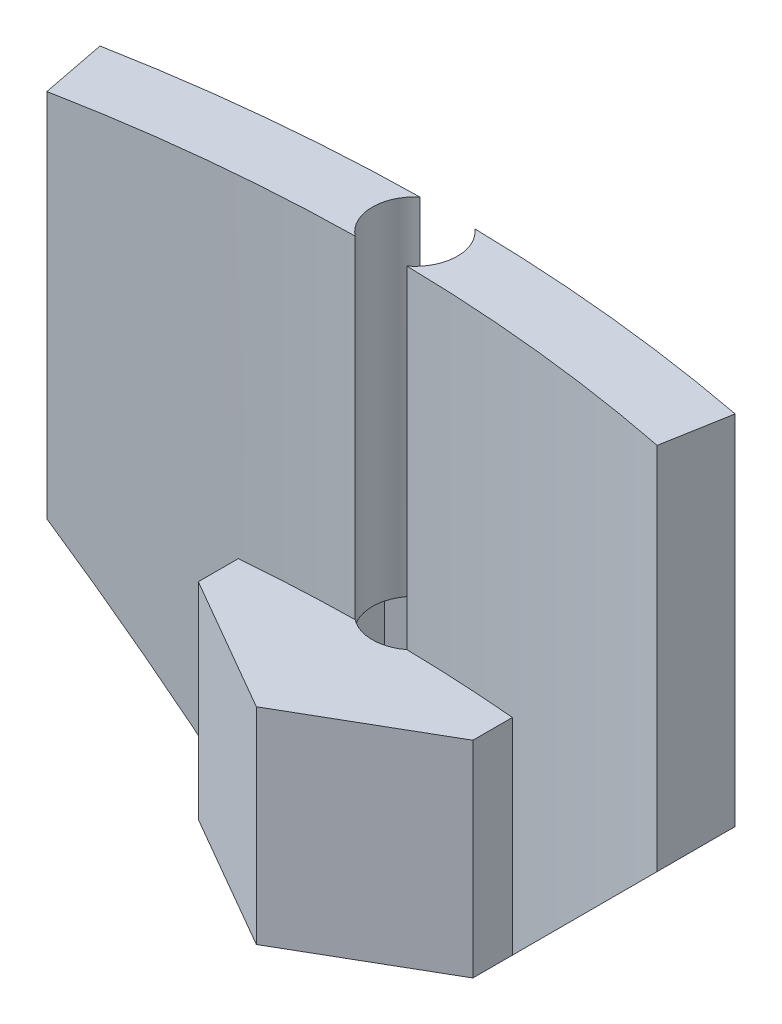
ISO-10303-21;
HEADER;
FILE_DESCRIPTION(('STEP AP214'),'2;1');
FILE_NAME('part.step','',(''),(''),'','','');
FILE_SCHEMA(('AUTOMOTIVE_DESIGN { 1 0 10303 214 1 1 1 1 }'));
ENDSEC;
DATA;
#1=APPLICATION_CONTEXT('core data for automotive mechanical design processes');
#2=APPLICATION_PROTOCOL_DEFINITION('international standard','automotive_design',2000,#1);
#3=PRODUCT_CONTEXT('',#1,'mechanical');
#4=PRODUCT('Part','Part','',(#3));
#5=PRODUCT_RELATED_PRODUCT_CATEGORY('part','',(#4));
#6=PRODUCT_DEFINITION_FORMATION('','',#4);
#7=PRODUCT_DEFINITION_CONTEXT('part definition',#1,'design');
#8=PRODUCT_DEFINITION('design','',#6,#7);
#9=PRODUCT_DEFINITION_SHAPE('','',#8);
#10=(LENGTH_UNIT() NAMED_UNIT(*) SI_UNIT(.MILLI.,.METRE.));
#11=(NAMED_UNIT(*) PLANE_ANGLE_UNIT() SI_UNIT($,.RADIAN.));
#12=(NAMED_UNIT(*) SI_UNIT($,.STERADIAN.) SOLID_ANGLE_UNIT());
#13=UNCERTAINTY_MEASURE_WITH_UNIT(LENGTH_MEASURE(1.E-05),#10,'distance_accuracy_value','');
#14=(GEOMETRIC_REPRESENTATION_CONTEXT(3) GLOBAL_UNCERTAINTY_ASSIGNED_CONTEXT((#13)) GLOBAL_UNIT_ASSIGNED_CONTEXT((#10,
#11,#12)) REPRESENTATION_CONTEXT('',''));
#15=CARTESIAN_POINT('',(0.,0.,0.));
#16=DIRECTION('',(0.,0.,1.));
#17=DIRECTION('',(1.,0.,0.));
#18=AXIS2_PLACEMENT_3D('',#15,#16,#17);
#19=CARTESIAN_POINT('',(10.,-15.,4.42781527170371));
#20=DIRECTION('',(1.,0.,0.));
#21=DIRECTION('',(0.,0.,-1.));
#22=AXIS2_PLACEMENT_3D('',#19,#20,#21);
#23=PLANE('',#22);
#24=DIRECTION('',(0.,0.,-1.));
#25=VECTOR('',#24,1.);
#26=CARTESIAN_POINT('',(10.,0.,4.42781527170371));
#27=LINE('',#26,#25);
#28=CARTESIAN_POINT('',(10.,0.,-3.30745786510135));
#29=VERTEX_POINT('',#28);
#30=CARTESIAN_POINT('',(10.,0.,-7.11919011208881));
#31=VERTEX_POINT('',#30);
#32=EDGE_CURVE('E450',#29,#31,#27,.T.);
#33=ORIENTED_EDGE('',*,*,#32,.F.);
#34=DIRECTION('',(0.,-1.,0.));
#35=VECTOR('',#34,1.);
#36=CARTESIAN_POINT('',(10.,0.,-3.30745786510135));
#37=LINE('',#36,#35);
#38=CARTESIAN_POINT('',(10.,-15.,-3.30745786510134));
#39=VERTEX_POINT('',#38);
#40=EDGE_CURVE('E214',#29,#39,#37,.T.);
#41=ORIENTED_EDGE('',*,*,#40,.T.);
#42=DIRECTION('',(0.,0.,-1.));
#43=VECTOR('',#42,1.);
#44=CARTESIAN_POINT('',(10.,-15.,4.42781527170371));
#45=LINE('',#44,#43);
#46=CARTESIAN_POINT('',(10.,-15.,-7.11919011208881));
#47=VERTEX_POINT('',#46);
#48=EDGE_CURVE('E469',#39,#47,#45,.T.);
#49=ORIENTED_EDGE('',*,*,#48,.T.);
#50=DIRECTION('',(0.,1.,0.));
#51=VECTOR('',#50,1.);
#52=CARTESIAN_POINT('',(10.,-15.,-7.11919011208881));
#53=LINE('',#52,#51);
#54=EDGE_CURVE('E486',#47,#31,#53,.T.);
#55=ORIENTED_EDGE('',*,*,#54,.T.);
#56=EDGE_LOOP('',(#33,#41,#49,#55));
#57=FACE_BOUND('',#56,.T.);
#58=ADVANCED_FACE('F190',(#57),#23,.T.);
#59=CARTESIAN_POINT('',(-10.,-15.,-7.11919011208881));
#60=DIRECTION('',(-1.,0.,0.));
#61=DIRECTION('',(0.,0.,1.));
#62=AXIS2_PLACEMENT_3D('',#59,#60,#61);
#63=PLANE('',#62);
#64=DIRECTION('',(0.,0.,1.));
#65=VECTOR('',#64,1.);
#66=CARTESIAN_POINT('',(-10.,0.,-7.11919011208881));
#67=LINE('',#66,#65);
#68=CARTESIAN_POINT('',(-10.,0.,1.51510033963902));
#69=VERTEX_POINT('',#68);
#70=CARTESIAN_POINT('',(-10.,0.,4.42781527170371));
#71=VERTEX_POINT('',#70);
#72=EDGE_CURVE('E496',#69,#71,#67,.T.);
#73=ORIENTED_EDGE('',*,*,#72,.F.);
#74=DIRECTION('',(0.,-1.,0.));
#75=VECTOR('',#74,1.);
#76=CARTESIAN_POINT('',(-10.,0.,1.51510033963902));
#77=LINE('',#76,#75);
#78=CARTESIAN_POINT('',(-10.,-15.,1.51510033963902));
#79=VERTEX_POINT('',#78);
#80=EDGE_CURVE('E234',#69,#79,#77,.T.);
#81=ORIENTED_EDGE('',*,*,#80,.T.);
#82=DIRECTION('',(0.,0.,1.));
#83=VECTOR('',#82,1.);
#84=CARTESIAN_POINT('',(-10.,-15.,-7.11919011208881));
#85=LINE('',#84,#83);
#86=CARTESIAN_POINT('',(-10.,-15.,4.42781527170371));
#87=VERTEX_POINT('',#86);
#88=EDGE_CURVE('E475',#79,#87,#85,.T.);
#89=ORIENTED_EDGE('',*,*,#88,.T.);
#90=DIRECTION('',(0.,1.,0.));
#91=VECTOR('',#90,1.);
#92=CARTESIAN_POINT('',(-10.,-15.,4.42781527170371));
#93=LINE('',#92,#91);
#94=EDGE_CURVE('E511',#87,#71,#93,.T.);
#95=ORIENTED_EDGE('',*,*,#94,.T.);
#96=EDGE_LOOP('',(#73,#81,#89,#95));
#97=FACE_BOUND('',#96,.T.);
#98=ADVANCED_FACE('F580',(#97),#63,.T.);
#99=CARTESIAN_POINT('',(-0.203357416899216,7.,116.598877624272));
#100=DIRECTION('',(0.,-1.,0.));
#101=DIRECTION('',(0.,0.,-1.));
#102=AXIS2_PLACEMENT_3D('',#99,#100,#101);
#103=CYLINDRICAL_SURFACE('',#102,115.5);
#104=CARTESIAN_POINT('',(-0.203357416899216,0.,116.598877624272));
#105=DIRECTION('',(0.,1.,0.));
#106=DIRECTION('',(0.,0.,1.));
#107=AXIS2_PLACEMENT_3D('',#104,#105,#106);
#108=CIRCLE('',#107,115.5);
#109=CARTESIAN_POINT('',(10.,0.,1.55044652926299));
#110=VERTEX_POINT('',#109);
#111=CARTESIAN_POINT('',(1.88194158466165,0.,1.1177037123563));
#112=VERTEX_POINT('',#111);
#113=EDGE_CURVE('E520',#110,#112,#108,.T.);
#114=ORIENTED_EDGE('',*,*,#113,.F.);
#115=DIRECTION('',(0.,-1.,0.));
#116=VECTOR('',#115,1.);
#117=CARTESIAN_POINT('',(10.,-15.,1.55044652926298));
#118=LINE('',#117,#116);
#119=CARTESIAN_POINT('',(10.,-15.,1.55044652926298));
#120=VERTEX_POINT('',#119);
#121=EDGE_CURVE('E533',#120,#110,#118,.F.);
#122=ORIENTED_EDGE('',*,*,#121,.F.);
#123=CARTESIAN_POINT('',(-0.203357416899216,-25.203357416899,116.598877624272));
#124=DIRECTION('',(-0.707106781186541,0.707106781186554,0.));
#125=DIRECTION('',(-0.707106781186554,-0.707106781186541,0.));
#126=AXIS2_PLACEMENT_3D('',#123,#124,#125);
#127=ELLIPSE('',#126,163.341666454091,115.5);
#128=CARTESIAN_POINT('',(22.3120871398352,-2.68791286016501,3.31470063378207));
#129=VERTEX_POINT('',#128);
#130=EDGE_CURVE('E12',#120,#129,#127,.F.);
#131=ORIENTED_EDGE('',*,*,#130,.T.);
#132=DIRECTION('',(0.,-1.,0.));
#133=VECTOR('',#132,1.);
#134=CARTESIAN_POINT('',(22.3120871398352,24.2,3.31470063378207));
#135=LINE('',#134,#133);
#136=CARTESIAN_POINT('',(22.3120871398352,24.2,3.31470063378207));
#137=VERTEX_POINT('',#136);
#138=EDGE_CURVE('E206',#137,#129,#135,.T.);
#139=ORIENTED_EDGE('',*,*,#138,.F.);
#140=CARTESIAN_POINT('',(-0.203357416899216,24.2,116.598877624272));
#141=DIRECTION('',(0.,1.,0.));
#142=DIRECTION('',(0.,0.,1.));
#143=AXIS2_PLACEMENT_3D('',#140,#141,#142);
#144=CIRCLE('',#143,115.5);
#145=CARTESIAN_POINT('',(1.88194158466172,24.2,1.11770371235628));
#146=VERTEX_POINT('',#145);
#147=EDGE_CURVE('E383',#146,#137,#144,.F.);
#148=ORIENTED_EDGE('',*,*,#147,.F.);
#149=DIRECTION('',(0.,-1.,0.));
#150=VECTOR('',#149,1.);
#151=CARTESIAN_POINT('',(1.88194158466174,-4.,1.11770371235641));
#152=LINE('',#151,#150);
#153=EDGE_CURVE('E411',#112,#146,#152,.F.);
#154=ORIENTED_EDGE('',*,*,#153,.F.);
#155=EDGE_LOOP('',(#114,#122,#131,#139,#148,#154));
#156=FACE_BOUND('',#155,.T.);
#157=ADVANCED_FACE('F557',(#156),#103,.F.);
#158=CARTESIAN_POINT('',(-0.203357416899206,7.,120.773731270976));
#159=DIRECTION('',(0.,-1.,0.));
#160=DIRECTION('',(0.,0.,-1.));
#161=AXIS2_PLACEMENT_3D('',#158,#159,#160);
#162=CYLINDRICAL_SURFACE('',#161,124.5);
#163=DIRECTION('',(0.,-1.,0.));
#164=VECTOR('',#163,1.);
#165=CARTESIAN_POINT('',(23.1634824320167,24.2,-1.5138020080754));
#166=LINE('',#165,#164);
#167=CARTESIAN_POINT('',(23.1634824320167,24.2,-1.5138020080754));
#168=VERTEX_POINT('',#167);
#169=CARTESIAN_POINT('',(23.1634824320167,-1.83651756798348,-1.5138020080754));
#170=VERTEX_POINT('',#169);
#171=EDGE_CURVE('E362',#168,#170,#166,.T.);
#172=ORIENTED_EDGE('',*,*,#171,.T.);
#173=CARTESIAN_POINT('',(-0.203357416899206,-25.203357416899,120.773731270976));
#174=DIRECTION('',(-0.707106781186541,0.707106781186554,0.));
#175=DIRECTION('',(-0.707106781186554,-0.707106781186541,0.));
#176=AXIS2_PLACEMENT_3D('',#173,#174,#175);
#177=ELLIPSE('',#176,176.069588515449,124.5);
#178=EDGE_CURVE('E199',#170,#39,#177,.T.);
#179=ORIENTED_EDGE('',*,*,#178,.T.);
#180=ORIENTED_EDGE('',*,*,#40,.F.);
#181=CARTESIAN_POINT('',(-0.203357416899206,0.,120.773731270976));
#182=DIRECTION('',(0.,1.,0.));
#183=DIRECTION('',(0.,0.,1.));
#184=AXIS2_PLACEMENT_3D('',#181,#182,#183);
#185=CIRCLE('',#184,124.5);
#186=CARTESIAN_POINT('',(2.00899020180866,0.,-3.70661062289088));
#187=VERTEX_POINT('',#186);
#188=EDGE_CURVE('E521',#187,#29,#185,.F.);
#189=ORIENTED_EDGE('',*,*,#188,.F.);
#190=DIRECTION('',(0.,-1.,0.));
#191=VECTOR('',#190,1.);
#192=CARTESIAN_POINT('',(2.0089902018084,-4.,-3.70661062289057));
#193=LINE('',#192,#191);
#194=CARTESIAN_POINT('',(2.0089902018084,24.2,-3.70661062289086));
#195=VERTEX_POINT('',#194);
#196=EDGE_CURVE('E375',#195,#187,#193,.T.);
#197=ORIENTED_EDGE('',*,*,#196,.F.);
#198=CARTESIAN_POINT('',(-0.203357416899206,24.2,120.773731270976));
#199=DIRECTION('',(0.,1.,0.));
#200=DIRECTION('',(0.,0.,1.));
#201=AXIS2_PLACEMENT_3D('',#198,#199,#200);
#202=CIRCLE('',#201,124.5);
#203=EDGE_CURVE('E373',#168,#195,#202,.T.);
#204=ORIENTED_EDGE('',*,*,#203,.F.);
#205=EDGE_LOOP('',(#172,#179,#180,#189,#197,#204));
#206=FACE_BOUND('',#205,.T.);
#207=ADVANCED_FACE('F374',(#206),#162,.T.);
#208=CARTESIAN_POINT('',(5.25,-15.,1.68540149305299));
#209=DIRECTION('',(1.,0.,0.));
#210=DIRECTION('',(0.,0.,-1.));
#211=AXIS2_PLACEMENT_3D('',#208,#209,#210);
#212=PLANE('',#211);
#213=DIRECTION('',(0.,0.,1.));
#214=VECTOR('',#213,1.);
#215=CARTESIAN_POINT('',(5.25,-1.,1.68540149305299));
#216=LINE('',#215,#214);
#217=CARTESIAN_POINT('',(5.25,-1.,-4.37677633343809));
#218=VERTEX_POINT('',#217);
#219=CARTESIAN_POINT('',(5.25,-1.,1.68540149305299));
#220=VERTEX_POINT('',#219);
#221=EDGE_CURVE('E425',#218,#220,#216,.T.);
#222=ORIENTED_EDGE('',*,*,#221,.F.);
#223=DIRECTION('',(0.,1.,0.));
#224=VECTOR('',#223,1.);
#225=CARTESIAN_POINT('',(5.25,-15.,-4.37677633343809));
#226=LINE('',#225,#224);
#227=CARTESIAN_POINT('',(5.25,-15.,-4.37677633343809));
#228=VERTEX_POINT('',#227);
#229=EDGE_CURVE('E446',#228,#218,#226,.T.);
#230=ORIENTED_EDGE('',*,*,#229,.F.);
#231=DIRECTION('',(0.,0.,-1.));
#232=VECTOR('',#231,1.);
#233=CARTESIAN_POINT('',(5.25,-15.,1.68540149305299));
#234=LINE('',#233,#232);
#235=CARTESIAN_POINT('',(5.25,-15.,1.68540149305299));
#236=VERTEX_POINT('',#235);
#237=EDGE_CURVE('E428',#236,#228,#234,.T.);
#238=ORIENTED_EDGE('',*,*,#237,.F.);
#239=DIRECTION('',(0.,1.,0.));
#240=VECTOR('',#239,1.);
#241=CARTESIAN_POINT('',(5.25,-15.,1.68540149305299));
#242=LINE('',#241,#240);
#243=EDGE_CURVE('E447',#236,#220,#242,.T.);
#244=ORIENTED_EDGE('',*,*,#243,.T.);
#245=EDGE_LOOP('',(#222,#230,#238,#244));
#246=FACE_BOUND('',#245,.T.);
#247=ADVANCED_FACE('F736',(#246),#212,.F.);
#248=CARTESIAN_POINT('',(0.,-15.,4.71649040629852));
#249=DIRECTION('',(0.5,0.,0.866025403784439));
#250=DIRECTION('',(0.866025403784439,0.,-0.5));
#251=AXIS2_PLACEMENT_3D('',#248,#249,#250);
#252=PLANE('',#251);
#253=DIRECTION('',(-0.866025403784439,0.,0.5));
#254=VECTOR('',#253,1.);
#255=CARTESIAN_POINT('',(0.,-1.,4.71649040629852));
#256=LINE('',#255,#254);
#257=CARTESIAN_POINT('',(0.,-1.,4.71649040629852));
#258=VERTEX_POINT('',#257);
#259=EDGE_CURVE('E422',#220,#258,#256,.T.);
#260=ORIENTED_EDGE('',*,*,#259,.F.);
#261=ORIENTED_EDGE('',*,*,#243,.F.);
#262=DIRECTION('',(0.866025403784439,0.,-0.5));
#263=VECTOR('',#262,1.);
#264=CARTESIAN_POINT('',(0.,-15.,4.71649040629852));
#265=LINE('',#264,#263);
#266=CARTESIAN_POINT('',(0.,-15.,4.71649040629852));
#267=VERTEX_POINT('',#266);
#268=EDGE_CURVE('E443',#267,#236,#265,.T.);
#269=ORIENTED_EDGE('',*,*,#268,.F.);
#270=DIRECTION('',(0.,1.,0.));
#271=VECTOR('',#270,1.);
#272=CARTESIAN_POINT('',(0.,-15.,4.71649040629852));
#273=LINE('',#272,#271);
#274=EDGE_CURVE('E451',#267,#258,#273,.T.);
#275=ORIENTED_EDGE('',*,*,#274,.T.);
#276=EDGE_LOOP('',(#260,#261,#269,#275));
#277=FACE_BOUND('',#276,.T.);
#278=ADVANCED_FACE('F820',(#277),#252,.F.);
#279=CARTESIAN_POINT('',(-5.25,-15.,1.68540149305298));
#280=DIRECTION('',(-0.5,0.,0.866025403784439));
#281=DIRECTION('',(0.866025403784439,0.,0.5));
#282=AXIS2_PLACEMENT_3D('',#279,#280,#281);
#283=PLANE('',#282);
#284=DIRECTION('',(-0.866025403784439,0.,-0.5));
#285=VECTOR('',#284,1.);
#286=CARTESIAN_POINT('',(-5.25,-1.,1.68540149305298));
#287=LINE('',#286,#285);
#288=CARTESIAN_POINT('',(-5.25,-1.,1.68540149305298));
#289=VERTEX_POINT('',#288);
#290=EDGE_CURVE('E419',#258,#289,#287,.T.);
#291=ORIENTED_EDGE('',*,*,#290,.F.);
#292=ORIENTED_EDGE('',*,*,#274,.F.);
#293=DIRECTION('',(0.866025403784439,0.,0.5));
#294=VECTOR('',#293,1.);
#295=CARTESIAN_POINT('',(-5.25,-15.,1.68540149305298));
#296=LINE('',#295,#294);
#297=CARTESIAN_POINT('',(-5.25,-15.,1.68540149305298));
#298=VERTEX_POINT('',#297);
#299=EDGE_CURVE('E440',#298,#267,#296,.T.);
#300=ORIENTED_EDGE('',*,*,#299,.F.);
#301=DIRECTION('',(0.,1.,0.));
#302=VECTOR('',#301,1.);
#303=CARTESIAN_POINT('',(-5.25,-15.,1.68540149305298));
#304=LINE('',#303,#302);
#305=EDGE_CURVE('E454',#298,#289,#304,.T.);
#306=ORIENTED_EDGE('',*,*,#305,.T.);
#307=EDGE_LOOP('',(#291,#292,#300,#306));
#308=FACE_BOUND('',#307,.T.);
#309=ADVANCED_FACE('F810',(#308),#283,.F.);
#310=CARTESIAN_POINT('',(-5.25,-15.,-4.37677633343809));
#311=DIRECTION('',(-1.,0.,0.));
#312=DIRECTION('',(0.,0.,1.));
#313=AXIS2_PLACEMENT_3D('',#310,#311,#312);
#314=PLANE('',#313);
#315=DIRECTION('',(0.,0.,-1.));
#316=VECTOR('',#315,1.);
#317=CARTESIAN_POINT('',(-5.25,-1.,-4.37677633343809));
#318=LINE('',#317,#316);
#319=CARTESIAN_POINT('',(-5.25,-1.,-4.37677633343809));
#320=VERTEX_POINT('',#319);
#321=EDGE_CURVE('E416',#289,#320,#318,.T.);
#322=ORIENTED_EDGE('',*,*,#321,.F.);
#323=ORIENTED_EDGE('',*,*,#305,.F.);
#324=DIRECTION('',(0.,0.,1.));
#325=VECTOR('',#324,1.);
#326=CARTESIAN_POINT('',(-5.25,-15.,-4.37677633343809));
#327=LINE('',#326,#325);
#328=CARTESIAN_POINT('',(-5.25,-15.,-4.37677633343809));
#329=VERTEX_POINT('',#328);
#330=EDGE_CURVE('E437',#329,#298,#327,.T.);
#331=ORIENTED_EDGE('',*,*,#330,.F.);
#332=DIRECTION('',(0.,1.,0.));
#333=VECTOR('',#332,1.);
#334=CARTESIAN_POINT('',(-5.25,-15.,-4.37677633343809));
#335=LINE('',#334,#333);
#336=EDGE_CURVE('E457',#329,#320,#335,.T.);
#337=ORIENTED_EDGE('',*,*,#336,.T.);
#338=EDGE_LOOP('',(#322,#323,#331,#337));
#339=FACE_BOUND('',#338,.T.);
#340=ADVANCED_FACE('F800',(#339),#314,.F.);
#341=CARTESIAN_POINT('',(0.,-15.,-7.40786524668362));
#342=DIRECTION('',(-0.5,0.,-0.866025403784439));
#343=DIRECTION('',(-0.866025403784439,0.,0.5));
#344=AXIS2_PLACEMENT_3D('',#341,#342,#343);
#345=PLANE('',#344);
#346=DIRECTION('',(0.866025403784439,0.,-0.5));
#347=VECTOR('',#346,1.);
#348=CARTESIAN_POINT('',(0.,-1.,-7.40786524668362));
#349=LINE('',#348,#347);
#350=CARTESIAN_POINT('',(0.,-1.,-7.40786524668362));
#351=VERTEX_POINT('',#350);
#352=EDGE_CURVE('E413',#320,#351,#349,.T.);
#353=ORIENTED_EDGE('',*,*,#352,.F.);
#354=ORIENTED_EDGE('',*,*,#336,.F.);
#355=DIRECTION('',(-0.866025403784439,0.,0.5));
#356=VECTOR('',#355,1.);
#357=CARTESIAN_POINT('',(0.,-15.,-7.40786524668362));
#358=LINE('',#357,#356);
#359=CARTESIAN_POINT('',(0.,-15.,-7.40786524668362));
#360=VERTEX_POINT('',#359);
#361=EDGE_CURVE('E434',#360,#329,#358,.T.);
#362=ORIENTED_EDGE('',*,*,#361,.F.);
#363=DIRECTION('',(0.,1.,0.));
#364=VECTOR('',#363,1.);
#365=CARTESIAN_POINT('',(0.,-15.,-7.40786524668362));
#366=LINE('',#365,#364);
#367=EDGE_CURVE('E460',#360,#351,#366,.T.);
#368=ORIENTED_EDGE('',*,*,#367,.T.);
#369=EDGE_LOOP('',(#353,#354,#362,#368));
#370=FACE_BOUND('',#369,.T.);
#371=ADVANCED_FACE('F790',(#370),#345,.F.);
#372=CARTESIAN_POINT('',(5.25,-15.,-4.37677633343809));
#373=DIRECTION('',(0.5,0.,-0.866025403784439));
#374=DIRECTION('',(-0.866025403784439,0.,-0.5));
#375=AXIS2_PLACEMENT_3D('',#372,#373,#374);
#376=PLANE('',#375);
#377=DIRECTION('',(0.866025403784439,0.,0.5));
#378=VECTOR('',#377,1.);
#379=CARTESIAN_POINT('',(5.25,-1.,-4.37677633343809));
#380=LINE('',#379,#378);
#381=EDGE_CURVE('E525',#351,#218,#380,.T.);
#382=ORIENTED_EDGE('',*,*,#381,.F.);
#383=ORIENTED_EDGE('',*,*,#367,.F.);
#384=DIRECTION('',(-0.866025403784439,0.,-0.5));
#385=VECTOR('',#384,1.);
#386=CARTESIAN_POINT('',(5.25,-15.,-4.37677633343809));
#387=LINE('',#386,#385);
#388=EDGE_CURVE('E431',#228,#360,#387,.T.);
#389=ORIENTED_EDGE('',*,*,#388,.F.);
#390=ORIENTED_EDGE('',*,*,#229,.T.);
#391=EDGE_LOOP('',(#382,#383,#389,#390));
#392=FACE_BOUND('',#391,.T.);
#393=ADVANCED_FACE('F745',(#392),#376,.F.);
#394=DIRECTION('',(0.,-1.,0.));
#395=VECTOR('',#394,1.);
#396=CARTESIAN_POINT('',(-22.2417963828894,24.2,3.22093793606659));
#397=LINE('',#396,#395);
#398=CARTESIAN_POINT('',(-22.2417963828894,24.2,3.22093793606659));
#399=VERTEX_POINT('',#398);
#400=CARTESIAN_POINT('',(-22.2417963828894,-2.75820361711079,3.22093793606659));
#401=VERTEX_POINT('',#400);
#402=EDGE_CURVE('E398',#399,#401,#397,.T.);
#403=ORIENTED_EDGE('',*,*,#402,.T.);
#404=CARTESIAN_POINT('',(-0.203357416899216,-24.7966425831006,116.598877624272));
#405=DIRECTION('',(0.707106781186541,0.707106781186554,0.));
#406=DIRECTION('',(0.707106781186554,-0.707106781186541,0.));
#407=AXIS2_PLACEMENT_3D('',#404,#405,#406);
#408=ELLIPSE('',#407,163.341666454091,115.5);
#409=EDGE_CURVE('E538',#401,#79,#408,.F.);
#410=ORIENTED_EDGE('',*,*,#409,.T.);
#411=ORIENTED_EDGE('',*,*,#80,.F.);
#412=CARTESIAN_POINT('',(-1.89042501949401,0.,1.11119948108521));
#413=VERTEX_POINT('',#412);
#414=EDGE_CURVE('E508',#413,#69,#108,.T.);
#415=ORIENTED_EDGE('',*,*,#414,.F.);
#416=DIRECTION('',(0.,-1.,0.));
#417=VECTOR('',#416,1.);
#418=CARTESIAN_POINT('',(-1.89042501949409,-4.,1.11119948108532));
#419=LINE('',#418,#417);
#420=CARTESIAN_POINT('',(-1.89042501949409,24.2,1.11119948108532));
#421=VERTEX_POINT('',#420);
#422=EDGE_CURVE('E409',#421,#413,#419,.T.);
#423=ORIENTED_EDGE('',*,*,#422,.F.);
#424=CARTESIAN_POINT('',(-0.203357416899216,24.2,116.598877624272));
#425=DIRECTION('',(0.,1.,0.));
#426=DIRECTION('',(0.,0.,1.));
#427=AXIS2_PLACEMENT_3D('',#424,#425,#426);
#428=CIRCLE('',#427,115.5);
#429=EDGE_CURVE('E370',#421,#399,#428,.T.);
#430=ORIENTED_EDGE('',*,*,#429,.T.);
#431=EDGE_LOOP('',(#403,#410,#411,#415,#423,#430));
#432=FACE_BOUND('',#431,.T.);
#433=ADVANCED_FACE('F581',(#432),#103,.F.);
#434=CARTESIAN_POINT('',(-10.,0.,-3.34023165865963));
#435=VERTEX_POINT('',#434);
#436=CARTESIAN_POINT('',(-2.00111610224713,0.,-3.71328838854208));
#437=VERTEX_POINT('',#436);
#438=EDGE_CURVE('E524',#435,#437,#185,.F.);
#439=ORIENTED_EDGE('',*,*,#438,.F.);
#440=DIRECTION('',(0.,-1.,0.));
#441=VECTOR('',#440,1.);
#442=CARTESIAN_POINT('',(-10.,-15.,-3.34023165865961));
#443=LINE('',#442,#441);
#444=CARTESIAN_POINT('',(-10.,-15.,-3.34023165865962));
#445=VERTEX_POINT('',#444);
#446=EDGE_CURVE('E528',#445,#435,#443,.F.);
#447=ORIENTED_EDGE('',*,*,#446,.F.);
#448=CARTESIAN_POINT('',(-0.203357416899206,-24.7966425831006,120.773731270976));
#449=DIRECTION('',(0.707106781186541,0.707106781186554,0.));
#450=DIRECTION('',(0.707106781186554,-0.707106781186541,0.));
#451=AXIS2_PLACEMENT_3D('',#448,#449,#450);
#452=ELLIPSE('',#451,176.069588515449,124.5);
#453=CARTESIAN_POINT('',(-23.1766272125127,-1.82337278748757,-1.58834976272474));
#454=VERTEX_POINT('',#453);
#455=EDGE_CURVE('E540',#445,#454,#452,.T.);
#456=ORIENTED_EDGE('',*,*,#455,.T.);
#457=DIRECTION('',(0.,-1.,0.));
#458=VECTOR('',#457,1.);
#459=CARTESIAN_POINT('',(-23.1766272125126,24.2,-1.58834976272459));
#460=LINE('',#459,#458);
#461=CARTESIAN_POINT('',(-23.1766272125126,24.2,-1.58834976272459));
#462=VERTEX_POINT('',#461);
#463=EDGE_CURVE('E226',#462,#454,#460,.T.);
#464=ORIENTED_EDGE('',*,*,#463,.F.);
#465=CARTESIAN_POINT('',(-0.203357416899206,24.2,120.773731270976));
#466=DIRECTION('',(0.,1.,0.));
#467=DIRECTION('',(0.,0.,1.));
#468=AXIS2_PLACEMENT_3D('',#465,#466,#467);
#469=CIRCLE('',#468,124.5);
#470=CARTESIAN_POINT('',(-2.00111610224688,24.2,-3.71328838854179));
#471=VERTEX_POINT('',#470);
#472=EDGE_CURVE('E394',#471,#462,#469,.T.);
#473=ORIENTED_EDGE('',*,*,#472,.F.);
#474=DIRECTION('',(0.,-1.,0.));
#475=VECTOR('',#474,1.);
#476=CARTESIAN_POINT('',(-2.00111610224688,-4.,-3.71328838854179));
#477=LINE('',#476,#475);
#478=EDGE_CURVE('E404',#437,#471,#477,.F.);
#479=ORIENTED_EDGE('',*,*,#478,.F.);
#480=EDGE_LOOP('',(#439,#447,#456,#464,#473,#479));
#481=FACE_BOUND('',#480,.T.);
#482=ADVANCED_FACE('F596',(#481),#162,.T.);
#483=CARTESIAN_POINT('',(0.,0.,0.));
#484=DIRECTION('',(0.,1.,0.));
#485=DIRECTION('',(0.,0.,1.));
#486=AXIS2_PLACEMENT_3D('',#483,#484,#485);
#487=PLANE('',#486);
#488=CARTESIAN_POINT('',(0.,0.,-1.34568742019255));
#489=DIRECTION('',(0.,1.,0.));
#490=DIRECTION('',(0.,0.,1.));
#491=AXIS2_PLACEMENT_3D('',#488,#489,#490);
#492=CIRCLE('',#491,3.1);
#493=EDGE_CURVE('E407',#413,#112,#492,.T.);
#494=ORIENTED_EDGE('',*,*,#493,.F.);
#495=ORIENTED_EDGE('',*,*,#414,.T.);
#496=ORIENTED_EDGE('',*,*,#72,.T.);
#497=DIRECTION('',(0.866025403784439,0.,0.5));
#498=VECTOR('',#497,1.);
#499=CARTESIAN_POINT('',(-10.,0.,4.42781527170371));
#500=LINE('',#499,#498);
#501=CARTESIAN_POINT('',(0.,0.,10.2013179636));
#502=VERTEX_POINT('',#501);
#503=EDGE_CURVE('E500',#71,#502,#500,.T.);
#504=ORIENTED_EDGE('',*,*,#503,.T.);
#505=DIRECTION('',(0.866025403784439,0.,-0.5));
#506=VECTOR('',#505,1.);
#507=CARTESIAN_POINT('',(0.,0.,10.2013179636));
#508=LINE('',#507,#506);
#509=CARTESIAN_POINT('',(10.,0.,4.42781527170371));
#510=VERTEX_POINT('',#509);
#511=EDGE_CURVE('E503',#502,#510,#508,.T.);
#512=ORIENTED_EDGE('',*,*,#511,.T.);
#513=EDGE_CURVE('E487',#510,#110,#27,.T.);
#514=ORIENTED_EDGE('',*,*,#513,.T.);
#515=ORIENTED_EDGE('',*,*,#113,.T.);
#516=EDGE_LOOP('',(#494,#495,#496,#504,#512,#514,#515));
#517=FACE_BOUND('',#516,.T.);
#518=ADVANCED_FACE('F565',(#517),#487,.T.);
#519=CARTESIAN_POINT('',(10.,-15.,4.42781527170371));
#520=VERTEX_POINT('',#519);
#521=EDGE_CURVE('E464',#520,#120,#45,.T.);
#522=ORIENTED_EDGE('',*,*,#521,.T.);
#523=ORIENTED_EDGE('',*,*,#121,.T.);
#524=ORIENTED_EDGE('',*,*,#513,.F.);
#525=DIRECTION('',(0.,1.,0.));
#526=VECTOR('',#525,1.);
#527=CARTESIAN_POINT('',(10.,-15.,4.42781527170371));
#528=LINE('',#527,#526);
#529=EDGE_CURVE('E506',#520,#510,#528,.T.);
#530=ORIENTED_EDGE('',*,*,#529,.F.);
#531=EDGE_LOOP('',(#522,#523,#524,#530));
#532=FACE_BOUND('',#531,.T.);
#533=ADVANCED_FACE('F562',(#532),#23,.T.);
#534=CARTESIAN_POINT('',(0.,-15.,10.2013179636));
#535=DIRECTION('',(0.5,0.,0.866025403784439));
#536=DIRECTION('',(0.866025403784439,0.,-0.5));
#537=AXIS2_PLACEMENT_3D('',#534,#535,#536);
#538=PLANE('',#537);
#539=ORIENTED_EDGE('',*,*,#511,.F.);
#540=DIRECTION('',(0.,1.,0.));
#541=VECTOR('',#540,1.);
#542=CARTESIAN_POINT('',(0.,-15.,10.2013179636));
#543=LINE('',#542,#541);
#544=CARTESIAN_POINT('',(0.,-15.,10.2013179636));
#545=VERTEX_POINT('',#544);
#546=EDGE_CURVE('E509',#545,#502,#543,.T.);
#547=ORIENTED_EDGE('',*,*,#546,.F.);
#548=DIRECTION('',(0.866025403784439,0.,-0.5));
#549=VECTOR('',#548,1.);
#550=CARTESIAN_POINT('',(0.,-15.,10.2013179636));
#551=LINE('',#550,#549);
#552=EDGE_CURVE('E483',#545,#520,#551,.T.);
#553=ORIENTED_EDGE('',*,*,#552,.T.);
#554=ORIENTED_EDGE('',*,*,#529,.T.);
#555=EDGE_LOOP('',(#539,#547,#553,#554));
#556=FACE_BOUND('',#555,.T.);
#557=ADVANCED_FACE('F570',(#556),#538,.T.);
#558=CARTESIAN_POINT('',(-10.,-15.,4.42781527170371));
#559=DIRECTION('',(-0.5,0.,0.866025403784439));
#560=DIRECTION('',(0.866025403784439,0.,0.5));
#561=AXIS2_PLACEMENT_3D('',#558,#559,#560);
#562=PLANE('',#561);
#563=ORIENTED_EDGE('',*,*,#503,.F.);
#564=ORIENTED_EDGE('',*,*,#94,.F.);
#565=DIRECTION('',(0.866025403784439,0.,0.5));
#566=VECTOR('',#565,1.);
#567=CARTESIAN_POINT('',(-10.,-15.,4.42781527170371));
#568=LINE('',#567,#566);
#569=EDGE_CURVE('E479',#87,#545,#568,.T.);
#570=ORIENTED_EDGE('',*,*,#569,.T.);
#571=ORIENTED_EDGE('',*,*,#546,.T.);
#572=EDGE_LOOP('',(#563,#564,#570,#571));
#573=FACE_BOUND('',#572,.T.);
#574=ADVANCED_FACE('F578',(#573),#562,.T.);
#575=CARTESIAN_POINT('',(-10.,-15.,-7.11919011208881));
#576=VERTEX_POINT('',#575);
#577=EDGE_CURVE('E476',#576,#445,#85,.T.);
#578=ORIENTED_EDGE('',*,*,#577,.T.);
#579=ORIENTED_EDGE('',*,*,#446,.T.);
#580=CARTESIAN_POINT('',(-10.,0.,-7.11919011208881));
#581=VERTEX_POINT('',#580);
#582=EDGE_CURVE('E497',#581,#435,#67,.T.);
#583=ORIENTED_EDGE('',*,*,#582,.F.);
#584=DIRECTION('',(0.,1.,0.));
#585=VECTOR('',#584,1.);
#586=CARTESIAN_POINT('',(-10.,-15.,-7.11919011208881));
#587=LINE('',#586,#585);
#588=EDGE_CURVE('E513',#576,#581,#587,.T.);
#589=ORIENTED_EDGE('',*,*,#588,.F.);
#590=EDGE_LOOP('',(#578,#579,#583,#589));
#591=FACE_BOUND('',#590,.T.);
#592=ADVANCED_FACE('F605',(#591),#63,.T.);
#593=CARTESIAN_POINT('',(0.,-15.,-12.8926928039851));
#594=DIRECTION('',(-0.5,0.,-0.866025403784439));
#595=DIRECTION('',(-0.866025403784439,0.,0.5));
#596=AXIS2_PLACEMENT_3D('',#593,#594,#595);
#597=PLANE('',#596);
#598=DIRECTION('',(-0.866025403784439,0.,0.5));
#599=VECTOR('',#598,1.);
#600=CARTESIAN_POINT('',(0.,0.,-12.8926928039851));
#601=LINE('',#600,#599);
#602=CARTESIAN_POINT('',(0.,0.,-12.8926928039851));
#603=VERTEX_POINT('',#602);
#604=EDGE_CURVE('E493',#603,#581,#601,.T.);
#605=ORIENTED_EDGE('',*,*,#604,.F.);
#606=DIRECTION('',(0.,1.,0.));
#607=VECTOR('',#606,1.);
#608=CARTESIAN_POINT('',(0.,-15.,-12.8926928039851));
#609=LINE('',#608,#607);
#610=CARTESIAN_POINT('',(0.,-15.,-12.8926928039851));
#611=VERTEX_POINT('',#610);
#612=EDGE_CURVE('E515',#611,#603,#609,.T.);
#613=ORIENTED_EDGE('',*,*,#612,.F.);
#614=DIRECTION('',(-0.866025403784439,0.,0.5));
#615=VECTOR('',#614,1.);
#616=CARTESIAN_POINT('',(0.,-15.,-12.8926928039851));
#617=LINE('',#616,#615);
#618=EDGE_CURVE('E472',#611,#576,#617,.T.);
#619=ORIENTED_EDGE('',*,*,#618,.T.);
#620=ORIENTED_EDGE('',*,*,#588,.T.);
#621=EDGE_LOOP('',(#605,#613,#619,#620));
#622=FACE_BOUND('',#621,.T.);
#623=ADVANCED_FACE('F609',(#622),#597,.T.);
#624=CARTESIAN_POINT('',(10.,-15.,-7.11919011208881));
#625=DIRECTION('',(0.5,0.,-0.866025403784439));
#626=DIRECTION('',(-0.866025403784439,0.,-0.5));
#627=AXIS2_PLACEMENT_3D('',#624,#625,#626);
#628=PLANE('',#627);
#629=DIRECTION('',(-0.866025403784439,0.,-0.5));
#630=VECTOR('',#629,1.);
#631=CARTESIAN_POINT('',(10.,0.,-7.11919011208881));
#632=LINE('',#631,#630);
#633=EDGE_CURVE('E490',#31,#603,#632,.T.);
#634=ORIENTED_EDGE('',*,*,#633,.F.);
#635=ORIENTED_EDGE('',*,*,#54,.F.);
#636=DIRECTION('',(-0.866025403784439,0.,-0.5));
#637=VECTOR('',#636,1.);
#638=CARTESIAN_POINT('',(10.,-15.,-7.11919011208881));
#639=LINE('',#638,#637);
#640=EDGE_CURVE('E467',#47,#611,#639,.T.);
#641=ORIENTED_EDGE('',*,*,#640,.T.);
#642=ORIENTED_EDGE('',*,*,#612,.T.);
#643=EDGE_LOOP('',(#634,#635,#641,#642));
#644=FACE_BOUND('',#643,.T.);
#645=ADVANCED_FACE('F612',(#644),#628,.T.);
#646=CARTESIAN_POINT('',(0.,-15.,0.));
#647=DIRECTION('',(0.,1.,0.));
#648=DIRECTION('',(0.,0.,1.));
#649=AXIS2_PLACEMENT_3D('',#646,#647,#648);
#650=PLANE('',#649);
#651=ORIENTED_EDGE('',*,*,#268,.T.);
#652=ORIENTED_EDGE('',*,*,#237,.T.);
#653=ORIENTED_EDGE('',*,*,#388,.T.);
#654=ORIENTED_EDGE('',*,*,#361,.T.);
#655=ORIENTED_EDGE('',*,*,#330,.T.);
#656=ORIENTED_EDGE('',*,*,#299,.T.);
#657=EDGE_LOOP('',(#651,#652,#653,#654,#655,#656));
#658=FACE_BOUND('',#657,.T.);
#659=ORIENTED_EDGE('',*,*,#521,.F.);
#660=ORIENTED_EDGE('',*,*,#552,.F.);
#661=ORIENTED_EDGE('',*,*,#569,.F.);
#662=ORIENTED_EDGE('',*,*,#88,.F.);
#663=EDGE_CURVE('E480',#445,#79,#85,.T.);
#664=ORIENTED_EDGE('',*,*,#663,.F.);
#665=ORIENTED_EDGE('',*,*,#577,.F.);
#666=ORIENTED_EDGE('',*,*,#618,.F.);
#667=ORIENTED_EDGE('',*,*,#640,.F.);
#668=ORIENTED_EDGE('',*,*,#48,.F.);
#669=EDGE_CURVE('E468',#120,#39,#45,.T.);
#670=ORIENTED_EDGE('',*,*,#669,.F.);
#671=EDGE_LOOP('',(#659,#660,#661,#662,#664,#665,#666,#667,#668,#670));
#672=FACE_BOUND('',#671,.T.);
#673=ADVANCED_FACE('F552',(#658,#672),#650,.F.);
#674=CARTESIAN_POINT('',(0.,0.,-1.34568742019255));
#675=DIRECTION('',(0.,1.,0.));
#676=DIRECTION('',(0.,0.,1.));
#677=AXIS2_PLACEMENT_3D('',#674,#675,#676);
#678=CIRCLE('',#677,3.1);
#679=EDGE_CURVE('E402',#187,#437,#678,.T.);
#680=ORIENTED_EDGE('',*,*,#679,.F.);
#681=ORIENTED_EDGE('',*,*,#188,.T.);
#682=ORIENTED_EDGE('',*,*,#32,.T.);
#683=ORIENTED_EDGE('',*,*,#633,.T.);
#684=ORIENTED_EDGE('',*,*,#604,.T.);
#685=ORIENTED_EDGE('',*,*,#582,.T.);
#686=ORIENTED_EDGE('',*,*,#438,.T.);
#687=EDGE_LOOP('',(#680,#681,#682,#683,#684,#685,#686));
#688=FACE_BOUND('',#687,.T.);
#689=ADVANCED_FACE('F614',(#688),#487,.T.);
#690=CARTESIAN_POINT('',(0.,-1.,0.));
#691=DIRECTION('',(0.,1.,0.));
#692=DIRECTION('',(0.,0.,1.));
#693=AXIS2_PLACEMENT_3D('',#690,#691,#692);
#694=PLANE('',#693);
#695=CARTESIAN_POINT('',(0.,-1.,-1.34568742019255));
#696=DIRECTION('',(0.,1.,0.));
#697=DIRECTION('',(0.,0.,1.));
#698=AXIS2_PLACEMENT_3D('',#695,#696,#697);
#699=CIRCLE('',#698,3.1);
#700=CARTESIAN_POINT('',(0.,-1.,1.75431257980745));
#701=VERTEX_POINT('',#700);
#702=EDGE_CURVE('E401',#701,#701,#699,.T.);
#703=ORIENTED_EDGE('',*,*,#702,.T.);
#704=EDGE_LOOP('',(#703));
#705=FACE_BOUND('',#704,.T.);
#706=ORIENTED_EDGE('',*,*,#381,.T.);
#707=ORIENTED_EDGE('',*,*,#221,.T.);
#708=ORIENTED_EDGE('',*,*,#259,.T.);
#709=ORIENTED_EDGE('',*,*,#290,.T.);
#710=ORIENTED_EDGE('',*,*,#321,.T.);
#711=ORIENTED_EDGE('',*,*,#352,.T.);
#712=EDGE_LOOP('',(#706,#707,#708,#709,#710,#711));
#713=FACE_BOUND('',#712,.T.);
#714=ADVANCED_FACE('F616',(#705,#713),#694,.F.);
#715=CARTESIAN_POINT('',(0.,7.,-1.34568742019255));
#716=DIRECTION('',(0.,-1.,0.));
#717=DIRECTION('',(0.,0.,-1.));
#718=AXIS2_PLACEMENT_3D('',#715,#716,#717);
#719=CYLINDRICAL_SURFACE('',#718,3.1);
#720=ORIENTED_EDGE('',*,*,#153,.T.);
#721=CARTESIAN_POINT('',(0.,24.2,-1.34568742019255));
#722=DIRECTION('',(0.,1.,0.));
#723=DIRECTION('',(0.,0.,1.));
#724=AXIS2_PLACEMENT_3D('',#721,#722,#723);
#725=CIRCLE('',#724,3.1);
#726=EDGE_CURVE('E379',#195,#146,#725,.F.);
#727=ORIENTED_EDGE('',*,*,#726,.F.);
#728=ORIENTED_EDGE('',*,*,#196,.T.);
#729=ORIENTED_EDGE('',*,*,#679,.T.);
#730=ORIENTED_EDGE('',*,*,#478,.T.);
#731=CARTESIAN_POINT('',(0.,24.2,-1.34568742019255));
#732=DIRECTION('',(0.,1.,0.));
#733=DIRECTION('',(0.,0.,1.));
#734=AXIS2_PLACEMENT_3D('',#731,#732,#733);
#735=CIRCLE('',#734,3.1);
#736=EDGE_CURVE('E391',#471,#421,#735,.T.);
#737=ORIENTED_EDGE('',*,*,#736,.T.);
#738=ORIENTED_EDGE('',*,*,#422,.T.);
#739=ORIENTED_EDGE('',*,*,#493,.T.);
#740=EDGE_LOOP('',(#720,#727,#728,#729,#730,#737,#738,#739));
#741=FACE_BOUND('',#740,.T.);
#742=ORIENTED_EDGE('',*,*,#702,.F.);
#743=EDGE_LOOP('',(#742));
#744=FACE_BOUND('',#743,.T.);
#745=ADVANCED_FACE('F588',(#741,#744),#719,.F.);
#746=CARTESIAN_POINT('',(-22.0353077367503,24.2,4.28322992981412));
#747=DIRECTION('',(0.981627183447665,0.,-0.190808995376538));
#748=DIRECTION('',(-0.190808995376538,0.,-0.981627183447665));
#749=AXIS2_PLACEMENT_3D('',#746,#747,#748);
#750=PLANE('',#749);
#751=ORIENTED_EDGE('',*,*,#463,.T.);
#752=DIRECTION('',(0.18742755999189,-0.187427559991886,0.964231206459828));
#753=VECTOR('',#752,1.);
#754=CARTESIAN_POINT('',(-22.9895786627304,-2.01042133726986,-0.626068394760827));
#755=LINE('',#754,#753);
#756=EDGE_CURVE('E536',#454,#401,#755,.T.);
#757=ORIENTED_EDGE('',*,*,#756,.T.);
#758=ORIENTED_EDGE('',*,*,#402,.F.);
#759=DIRECTION('',(0.190808995376538,0.,0.981627183447665));
#760=VECTOR('',#759,1.);
#761=CARTESIAN_POINT('',(-22.0353077367503,24.2,4.28322992981412));
#762=LINE('',#761,#760);
#763=EDGE_CURVE('E396',#462,#399,#762,.T.);
#764=ORIENTED_EDGE('',*,*,#763,.F.);
#765=EDGE_LOOP('',(#751,#757,#758,#764));
#766=FACE_BOUND('',#765,.T.);
#767=ADVANCED_FACE('F599',(#766),#750,.F.);
#768=CARTESIAN_POINT('',(0.,24.2,0.));
#769=DIRECTION('',(0.,1.,0.));
#770=DIRECTION('',(0.,0.,1.));
#771=AXIS2_PLACEMENT_3D('',#768,#769,#770);
#772=PLANE('',#771);
#773=ORIENTED_EDGE('',*,*,#429,.F.);
#774=ORIENTED_EDGE('',*,*,#736,.F.);
#775=ORIENTED_EDGE('',*,*,#472,.T.);
#776=ORIENTED_EDGE('',*,*,#763,.T.);
#777=EDGE_LOOP('',(#773,#774,#775,#776));
#778=FACE_BOUND('',#777,.T.);
#779=ADVANCED_FACE('F586',(#778),#772,.T.);
#780=CARTESIAN_POINT('',(22.2061425826592,24.2,3.91554207478182));
#781=DIRECTION('',(0.984807753012209,0.,0.173648177666924));
#782=DIRECTION('',(0.173648177666924,0.,-0.984807753012209));
#783=AXIS2_PLACEMENT_3D('',#780,#781,#782);
#784=PLANE('',#783);
#785=ORIENTED_EDGE('',*,*,#138,.T.);
#786=DIRECTION('',(0.171087869746029,0.171087869746026,-0.970287525247817));
#787=VECTOR('',#786,1.);
#788=CARTESIAN_POINT('',(23.0196982278024,-1.9803017721978,-0.698361264766492));
#789=LINE('',#788,#787);
#790=EDGE_CURVE('E368',#129,#170,#789,.T.);
#791=ORIENTED_EDGE('',*,*,#790,.T.);
#792=ORIENTED_EDGE('',*,*,#171,.F.);
#793=DIRECTION('',(-0.173648177666924,0.,0.984807753012209));
#794=VECTOR('',#793,1.);
#795=CARTESIAN_POINT('',(22.2061425826592,24.2,3.91554207478182));
#796=LINE('',#795,#794);
#797=EDGE_CURVE('E366',#168,#137,#796,.T.);
#798=ORIENTED_EDGE('',*,*,#797,.T.);
#799=EDGE_LOOP('',(#785,#791,#792,#798));
#800=FACE_BOUND('',#799,.T.);
#801=ADVANCED_FACE('F364',(#800),#784,.T.);
#802=CARTESIAN_POINT('',(0.,24.2,0.));
#803=DIRECTION('',(0.,1.,0.));
#804=DIRECTION('',(0.,0.,1.));
#805=AXIS2_PLACEMENT_3D('',#802,#803,#804);
#806=PLANE('',#805);
#807=ORIENTED_EDGE('',*,*,#797,.F.);
#808=ORIENTED_EDGE('',*,*,#203,.T.);
#809=ORIENTED_EDGE('',*,*,#726,.T.);
#810=ORIENTED_EDGE('',*,*,#147,.T.);
#811=EDGE_LOOP('',(#807,#808,#809,#810));
#812=FACE_BOUND('',#811,.T.);
#813=ADVANCED_FACE('F381',(#812),#806,.T.);
#814=CARTESIAN_POINT('',(-25.0000000000003,0.,0.));
#815=DIRECTION('',(0.707106781186541,0.707106781186554,0.));
#816=DIRECTION('',(0.,0.,1.));
#817=AXIS2_PLACEMENT_3D('',#814,#815,#816);
#818=PLANE('',#817);
#819=ORIENTED_EDGE('',*,*,#455,.F.);
#820=ORIENTED_EDGE('',*,*,#663,.T.);
#821=ORIENTED_EDGE('',*,*,#409,.F.);
#822=ORIENTED_EDGE('',*,*,#756,.F.);
#823=EDGE_LOOP('',(#819,#820,#821,#822));
#824=FACE_BOUND('',#823,.T.);
#825=ADVANCED_FACE('F602',(#824),#818,.F.);
#826=CARTESIAN_POINT('',(25.0000000000003,0.,0.));
#827=DIRECTION('',(-0.707106781186541,0.707106781186554,0.));
#828=DIRECTION('',(0.,0.,-1.));
#829=AXIS2_PLACEMENT_3D('',#826,#827,#828);
#830=PLANE('',#829);
#831=ORIENTED_EDGE('',*,*,#130,.F.);
#832=ORIENTED_EDGE('',*,*,#669,.T.);
#833=ORIENTED_EDGE('',*,*,#178,.F.);
#834=ORIENTED_EDGE('',*,*,#790,.F.);
#835=EDGE_LOOP('',(#831,#832,#833,#834));
#836=FACE_BOUND('',#835,.T.);
#837=ADVANCED_FACE('F193',(#836),#830,.F.);
#838=CLOSED_SHELL('',(#58,#98,#157,#207,#247,#278,#309,#340,#371,#393,#433,#482,#518,#533,#557,
#574,#592,#623,#645,#673,#689,#714,#745,#767,#779,#801,#813,#825,#837));
#839=MANIFOLD_SOLID_BREP('B2',#838);
#840=ADVANCED_BREP_SHAPE_REPRESENTATION('',(#18,#839),#14);
#841=SHAPE_DEFINITION_REPRESENTATION(#9,#840);
ENDSEC;
END-ISO-10303-21;
